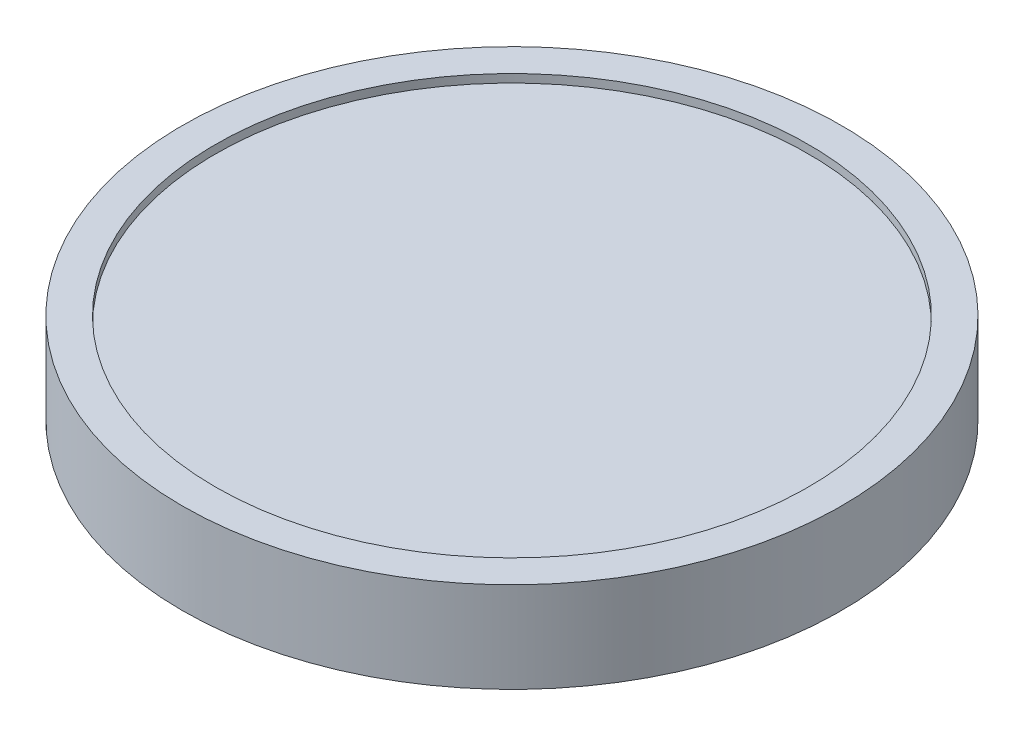
ISO-10303-21;
HEADER;
FILE_DESCRIPTION(('STEP AP214'),'2;1');
FILE_NAME('part.step','',(''),(''),'','','');
FILE_SCHEMA(('AUTOMOTIVE_DESIGN { 1 0 10303 214 1 1 1 1 }'));
ENDSEC;
DATA;
#1=APPLICATION_CONTEXT('core data for automotive mechanical design processes');
#2=APPLICATION_PROTOCOL_DEFINITION('international standard','automotive_design',2000,#1);
#3=PRODUCT_CONTEXT('',#1,'mechanical');
#4=PRODUCT('Part','Part','',(#3));
#5=PRODUCT_RELATED_PRODUCT_CATEGORY('part','',(#4));
#6=PRODUCT_DEFINITION_FORMATION('','',#4);
#7=PRODUCT_DEFINITION_CONTEXT('part definition',#1,'design');
#8=PRODUCT_DEFINITION('design','',#6,#7);
#9=PRODUCT_DEFINITION_SHAPE('','',#8);
#10=(LENGTH_UNIT() NAMED_UNIT(*) SI_UNIT(.MILLI.,.METRE.));
#11=(NAMED_UNIT(*) PLANE_ANGLE_UNIT() SI_UNIT($,.RADIAN.));
#12=(NAMED_UNIT(*) SI_UNIT($,.STERADIAN.) SOLID_ANGLE_UNIT());
#13=UNCERTAINTY_MEASURE_WITH_UNIT(LENGTH_MEASURE(1.E-05),#10,'distance_accuracy_value','');
#14=(GEOMETRIC_REPRESENTATION_CONTEXT(3) GLOBAL_UNCERTAINTY_ASSIGNED_CONTEXT((#13)) GLOBAL_UNIT_ASSIGNED_CONTEXT((#10,
#11,#12)) REPRESENTATION_CONTEXT('',''));
#15=CARTESIAN_POINT('',(0.,0.,0.));
#16=DIRECTION('',(0.,0.,1.));
#17=DIRECTION('',(1.,0.,0.));
#18=AXIS2_PLACEMENT_3D('',#15,#16,#17);
#19=CARTESIAN_POINT('',(-6.98213292298362,0.,-12.9243737085016));
#20=DIRECTION('',(0.,1.,0.));
#21=DIRECTION('',(0.,0.,1.));
#22=AXIS2_PLACEMENT_3D('',#19,#20,#21);
#23=PLANE('',#22);
#24=CARTESIAN_POINT('',(-6.98213292298362,0.,-12.9243737085016));
#25=DIRECTION('',(0.,1.,0.));
#26=DIRECTION('',(0.,0.,1.));
#27=AXIS2_PLACEMENT_3D('',#24,#25,#26);
#28=CIRCLE('',#27,40.);
#29=CARTESIAN_POINT('',(-6.98213292298362,0.,27.0756262914984));
#30=VERTEX_POINT('',#29);
#31=EDGE_CURVE('E43',#30,#30,#28,.T.);
#32=ORIENTED_EDGE('',*,*,#31,.F.);
#33=EDGE_LOOP('',(#32));
#34=FACE_BOUND('',#33,.T.);
#35=DIRECTION('',(0.,0.,-1.));
#36=VECTOR('',#35,1.);
#37=CARTESIAN_POINT('',(-13.4821329229836,0.,-20.9243737085016));
#38=LINE('',#37,#36);
#39=CARTESIAN_POINT('',(-13.4821329229836,0.,-4.92437370850164));
#40=VERTEX_POINT('',#39);
#41=CARTESIAN_POINT('',(-13.4821329229836,0.,-20.9243737085016));
#42=VERTEX_POINT('',#41);
#43=EDGE_CURVE('E55',#40,#42,#38,.T.);
#44=ORIENTED_EDGE('',*,*,#43,.F.);
#45=DIRECTION('',(-1.,0.,0.));
#46=VECTOR('',#45,1.);
#47=CARTESIAN_POINT('',(-0.482132922983617,0.,-4.92437370850164));
#48=LINE('',#47,#46);
#49=CARTESIAN_POINT('',(-0.482132922983617,0.,-4.92437370850164));
#50=VERTEX_POINT('',#49);
#51=EDGE_CURVE('E59',#50,#40,#48,.T.);
#52=ORIENTED_EDGE('',*,*,#51,.F.);
#53=DIRECTION('',(0.,0.,1.));
#54=VECTOR('',#53,1.);
#55=CARTESIAN_POINT('',(-0.482132922983617,0.,-20.9243737085016));
#56=LINE('',#55,#54);
#57=CARTESIAN_POINT('',(-0.482132922983617,0.,-20.9243737085016));
#58=VERTEX_POINT('',#57);
#59=EDGE_CURVE('E216',#58,#50,#56,.T.);
#60=ORIENTED_EDGE('',*,*,#59,.F.);
#61=DIRECTION('',(1.,0.,0.));
#62=VECTOR('',#61,1.);
#63=CARTESIAN_POINT('',(-0.482132922983617,0.,-20.9243737085016));
#64=LINE('',#63,#62);
#65=EDGE_CURVE('E226',#42,#58,#64,.T.);
#66=ORIENTED_EDGE('',*,*,#65,.F.);
#67=EDGE_LOOP('',(#44,#52,#60,#66));
#68=FACE_BOUND('',#67,.T.);
#69=ADVANCED_FACE('F39',(#34,#68),#23,.F.);
#70=CARTESIAN_POINT('',(-6.98213292298362,11.,-12.9243737085016));
#71=DIRECTION('',(0.,-1.,0.));
#72=DIRECTION('',(0.,0.,-1.));
#73=AXIS2_PLACEMENT_3D('',#70,#71,#72);
#74=CYLINDRICAL_SURFACE('',#73,40.);
#75=CARTESIAN_POINT('',(-6.98213292298362,11.,-12.9243737085016));
#76=DIRECTION('',(0.,1.,0.));
#77=DIRECTION('',(0.,0.,1.));
#78=AXIS2_PLACEMENT_3D('',#75,#76,#77);
#79=CIRCLE('',#78,40.);
#80=CARTESIAN_POINT('',(-6.98213292298362,11.,27.0756262914984));
#81=VERTEX_POINT('',#80);
#82=EDGE_CURVE('E11',#81,#81,#79,.T.);
#83=ORIENTED_EDGE('',*,*,#82,.F.);
#84=EDGE_LOOP('',(#83));
#85=FACE_BOUND('',#84,.T.);
#86=ORIENTED_EDGE('',*,*,#31,.T.);
#87=EDGE_LOOP('',(#86));
#88=FACE_BOUND('',#87,.T.);
#89=ADVANCED_FACE('F41',(#85,#88),#74,.T.);
#90=CARTESIAN_POINT('',(-6.98213292298362,11.,-12.9243737085016));
#91=DIRECTION('',(0.,1.,0.));
#92=DIRECTION('',(0.,0.,1.));
#93=AXIS2_PLACEMENT_3D('',#90,#91,#92);
#94=PLANE('',#93);
#95=CARTESIAN_POINT('',(-6.98213292298362,11.,-12.9243737085016));
#96=DIRECTION('',(0.,1.,0.));
#97=DIRECTION('',(0.,0.,1.));
#98=AXIS2_PLACEMENT_3D('',#95,#96,#97);
#99=CIRCLE('',#98,36.);
#100=CARTESIAN_POINT('',(-6.98213292298362,11.,23.0756262914983));
#101=VERTEX_POINT('',#100);
#102=EDGE_CURVE('E104',#101,#101,#99,.T.);
#103=ORIENTED_EDGE('',*,*,#102,.F.);
#104=EDGE_LOOP('',(#103));
#105=FACE_BOUND('',#104,.T.);
#106=ORIENTED_EDGE('',*,*,#82,.T.);
#107=EDGE_LOOP('',(#106));
#108=FACE_BOUND('',#107,.T.);
#109=ADVANCED_FACE('F128',(#105,#108),#94,.T.);
#110=CARTESIAN_POINT('',(-6.98213292298362,10.,-12.9243737085016));
#111=DIRECTION('',(0.,1.,0.));
#112=DIRECTION('',(0.,0.,1.));
#113=AXIS2_PLACEMENT_3D('',#110,#111,#112);
#114=CYLINDRICAL_SURFACE('',#113,36.);
#115=CARTESIAN_POINT('',(-6.98213292298362,10.,-12.9243737085016));
#116=DIRECTION('',(0.,1.,0.));
#117=DIRECTION('',(0.,0.,1.));
#118=AXIS2_PLACEMENT_3D('',#115,#116,#117);
#119=CIRCLE('',#118,36.);
#120=CARTESIAN_POINT('',(-6.98213292298362,10.,23.0756262914983));
#121=VERTEX_POINT('',#120);
#122=EDGE_CURVE('E109',#121,#121,#119,.T.);
#123=ORIENTED_EDGE('',*,*,#122,.F.);
#124=EDGE_LOOP('',(#123));
#125=FACE_BOUND('',#124,.T.);
#126=ORIENTED_EDGE('',*,*,#102,.T.);
#127=EDGE_LOOP('',(#126));
#128=FACE_BOUND('',#127,.T.);
#129=ADVANCED_FACE('F133',(#125,#128),#114,.F.);
#130=CARTESIAN_POINT('',(-6.98213292298362,10.,-12.9243737085016));
#131=DIRECTION('',(0.,1.,0.));
#132=DIRECTION('',(0.,0.,1.));
#133=AXIS2_PLACEMENT_3D('',#130,#131,#132);
#134=PLANE('',#133);
#135=ORIENTED_EDGE('',*,*,#122,.T.);
#136=EDGE_LOOP('',(#135));
#137=FACE_BOUND('',#136,.T.);
#138=ADVANCED_FACE('F137',(#137),#134,.T.);
#139=CARTESIAN_POINT('',(-13.4821329229836,-7.,-20.9243737085016));
#140=DIRECTION('',(1.,0.,0.));
#141=DIRECTION('',(0.,0.,-1.));
#142=AXIS2_PLACEMENT_3D('',#139,#140,#141);
#143=PLANE('',#142);
#144=ORIENTED_EDGE('',*,*,#43,.T.);
#145=DIRECTION('',(0.,1.,0.));
#146=VECTOR('',#145,1.);
#147=CARTESIAN_POINT('',(-13.4821329229836,-7.,-20.9243737085016));
#148=LINE('',#147,#146);
#149=CARTESIAN_POINT('',(-13.4821329229836,-7.,-20.9243737085016));
#150=VERTEX_POINT('',#149);
#151=EDGE_CURVE('E84',#150,#42,#148,.T.);
#152=ORIENTED_EDGE('',*,*,#151,.F.);
#153=DIRECTION('',(0.,0.,-1.));
#154=VECTOR('',#153,1.);
#155=CARTESIAN_POINT('',(-13.4821329229836,-7.,-20.9243737085016));
#156=LINE('',#155,#154);
#157=CARTESIAN_POINT('',(-13.4821329229836,-7.,-4.92437370850164));
#158=VERTEX_POINT('',#157);
#159=EDGE_CURVE('E91',#158,#150,#156,.T.);
#160=ORIENTED_EDGE('',*,*,#159,.F.);
#161=DIRECTION('',(0.,1.,0.));
#162=VECTOR('',#161,1.);
#163=CARTESIAN_POINT('',(-13.4821329229836,-7.,-4.92437370850164));
#164=LINE('',#163,#162);
#165=EDGE_CURVE('E213',#158,#40,#164,.T.);
#166=ORIENTED_EDGE('',*,*,#165,.T.);
#167=EDGE_LOOP('',(#144,#152,#160,#166));
#168=FACE_BOUND('',#167,.T.);
#169=ADVANCED_FACE('F102',(#168),#143,.F.);
#170=CARTESIAN_POINT('',(-0.482132922983617,-7.,-20.9243737085016));
#171=DIRECTION('',(0.,0.,1.));
#172=DIRECTION('',(1.,0.,0.));
#173=AXIS2_PLACEMENT_3D('',#170,#171,#172);
#174=PLANE('',#173);
#175=ORIENTED_EDGE('',*,*,#65,.T.);
#176=DIRECTION('',(0.,1.,0.));
#177=VECTOR('',#176,1.);
#178=CARTESIAN_POINT('',(-0.482132922983617,-7.,-20.9243737085016));
#179=LINE('',#178,#177);
#180=CARTESIAN_POINT('',(-0.482132922983617,-7.,-20.9243737085016));
#181=VERTEX_POINT('',#180);
#182=EDGE_CURVE('E86',#181,#58,#179,.T.);
#183=ORIENTED_EDGE('',*,*,#182,.F.);
#184=DIRECTION('',(1.,0.,0.));
#185=VECTOR('',#184,1.);
#186=CARTESIAN_POINT('',(-0.482132922983617,-7.,-20.9243737085016));
#187=LINE('',#186,#185);
#188=EDGE_CURVE('E79',#150,#181,#187,.T.);
#189=ORIENTED_EDGE('',*,*,#188,.F.);
#190=ORIENTED_EDGE('',*,*,#151,.T.);
#191=EDGE_LOOP('',(#175,#183,#189,#190));
#192=FACE_BOUND('',#191,.T.);
#193=ADVANCED_FACE('F82',(#192),#174,.F.);
#194=CARTESIAN_POINT('',(-0.482132922983617,-7.,-20.9243737085016));
#195=DIRECTION('',(-1.,0.,0.));
#196=DIRECTION('',(0.,0.,1.));
#197=AXIS2_PLACEMENT_3D('',#194,#195,#196);
#198=PLANE('',#197);
#199=ORIENTED_EDGE('',*,*,#59,.T.);
#200=DIRECTION('',(0.,1.,0.));
#201=VECTOR('',#200,1.);
#202=CARTESIAN_POINT('',(-0.482132922983617,-7.,-4.92437370850164));
#203=LINE('',#202,#201);
#204=CARTESIAN_POINT('',(-0.482132922983617,-7.,-4.92437370850164));
#205=VERTEX_POINT('',#204);
#206=EDGE_CURVE('E111',#205,#50,#203,.T.);
#207=ORIENTED_EDGE('',*,*,#206,.F.);
#208=DIRECTION('',(0.,0.,1.));
#209=VECTOR('',#208,1.);
#210=CARTESIAN_POINT('',(-0.482132922983617,-7.,-20.9243737085016));
#211=LINE('',#210,#209);
#212=EDGE_CURVE('E90',#181,#205,#211,.T.);
#213=ORIENTED_EDGE('',*,*,#212,.F.);
#214=ORIENTED_EDGE('',*,*,#182,.T.);
#215=EDGE_LOOP('',(#199,#207,#213,#214));
#216=FACE_BOUND('',#215,.T.);
#217=ADVANCED_FACE('F145',(#216),#198,.F.);
#218=CARTESIAN_POINT('',(-0.482132922983617,-7.,-4.92437370850164));
#219=DIRECTION('',(0.,0.,-1.));
#220=DIRECTION('',(-1.,0.,0.));
#221=AXIS2_PLACEMENT_3D('',#218,#219,#220);
#222=PLANE('',#221);
#223=ORIENTED_EDGE('',*,*,#51,.T.);
#224=ORIENTED_EDGE('',*,*,#165,.F.);
#225=DIRECTION('',(-1.,0.,0.));
#226=VECTOR('',#225,1.);
#227=CARTESIAN_POINT('',(-0.482132922983617,-7.,-4.92437370850164));
#228=LINE('',#227,#226);
#229=EDGE_CURVE('E96',#205,#158,#228,.T.);
#230=ORIENTED_EDGE('',*,*,#229,.F.);
#231=ORIENTED_EDGE('',*,*,#206,.T.);
#232=EDGE_LOOP('',(#223,#224,#230,#231));
#233=FACE_BOUND('',#232,.T.);
#234=ADVANCED_FACE('F148',(#233),#222,.F.);
#235=CARTESIAN_POINT('',(0.,-7.,0.));
#236=DIRECTION('',(0.,-1.,0.));
#237=DIRECTION('',(0.,0.,-1.));
#238=AXIS2_PLACEMENT_3D('',#235,#236,#237);
#239=PLANE('',#238);
#240=ORIENTED_EDGE('',*,*,#159,.T.);
#241=ORIENTED_EDGE('',*,*,#188,.T.);
#242=ORIENTED_EDGE('',*,*,#212,.T.);
#243=ORIENTED_EDGE('',*,*,#229,.T.);
#244=EDGE_LOOP('',(#240,#241,#242,#243));
#245=FACE_BOUND('',#244,.T.);
#246=ADVANCED_FACE('F94',(#245),#239,.T.);
#247=CLOSED_SHELL('',(#69,#89,#109,#129,#138,#169,#193,#217,#234,#246));
#248=MANIFOLD_SOLID_BREP('B2',#247);
#249=ADVANCED_BREP_SHAPE_REPRESENTATION('',(#18,#248),#14);
#250=SHAPE_DEFINITION_REPRESENTATION(#9,#249);
ENDSEC;
END-ISO-10303-21;
